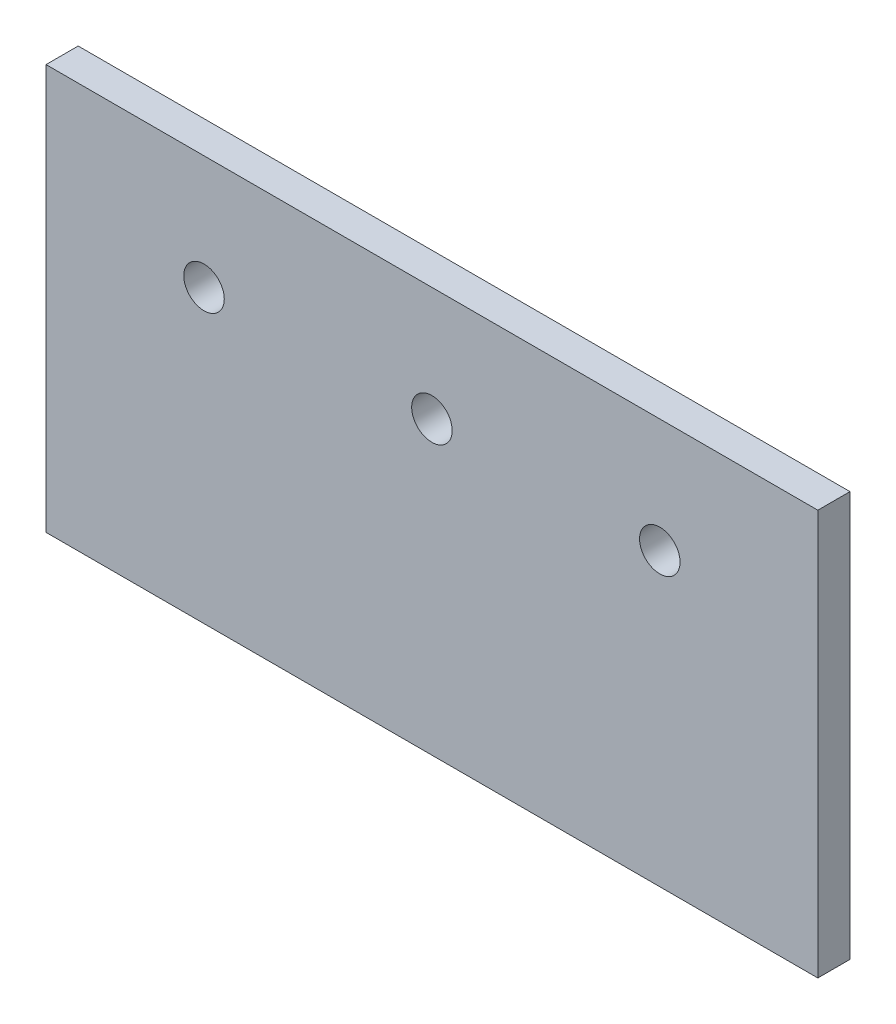
ISO-10303-21;
HEADER;
FILE_DESCRIPTION(('STEP AP214'),'2;1');
FILE_NAME('part.step','',(''),(''),'','','');
FILE_SCHEMA(('AUTOMOTIVE_DESIGN { 1 0 10303 214 1 1 1 1 }'));
ENDSEC;
DATA;
#1=APPLICATION_CONTEXT('core data for automotive mechanical design processes');
#2=APPLICATION_PROTOCOL_DEFINITION('international standard','automotive_design',2000,#1);
#3=PRODUCT_CONTEXT('',#1,'mechanical');
#4=PRODUCT('Part','Part','',(#3));
#5=PRODUCT_RELATED_PRODUCT_CATEGORY('part','',(#4));
#6=PRODUCT_DEFINITION_FORMATION('','',#4);
#7=PRODUCT_DEFINITION_CONTEXT('part definition',#1,'design');
#8=PRODUCT_DEFINITION('design','',#6,#7);
#9=PRODUCT_DEFINITION_SHAPE('','',#8);
#10=(LENGTH_UNIT() NAMED_UNIT(*) SI_UNIT(.MILLI.,.METRE.));
#11=(NAMED_UNIT(*) PLANE_ANGLE_UNIT() SI_UNIT($,.RADIAN.));
#12=(NAMED_UNIT(*) SI_UNIT($,.STERADIAN.) SOLID_ANGLE_UNIT());
#13=UNCERTAINTY_MEASURE_WITH_UNIT(LENGTH_MEASURE(1.E-05),#10,'distance_accuracy_value','');
#14=(GEOMETRIC_REPRESENTATION_CONTEXT(3) GLOBAL_UNCERTAINTY_ASSIGNED_CONTEXT((#13)) GLOBAL_UNIT_ASSIGNED_CONTEXT((#10,
#11,#12)) REPRESENTATION_CONTEXT('',''));
#15=CARTESIAN_POINT('',(0.,0.,0.));
#16=DIRECTION('',(0.,0.,1.));
#17=DIRECTION('',(1.,0.,0.));
#18=AXIS2_PLACEMENT_3D('',#15,#16,#17);
#19=CARTESIAN_POINT('',(0.,0.,6.35));
#20=DIRECTION('',(0.,0.,1.));
#21=DIRECTION('',(1.,0.,0.));
#22=AXIS2_PLACEMENT_3D('',#19,#20,#21);
#23=PLANE('',#22);
#24=CARTESIAN_POINT('',(31.2,-22.5,6.35));
#25=DIRECTION('',(0.,0.,1.));
#26=DIRECTION('',(1.,0.,0.));
#27=AXIS2_PLACEMENT_3D('',#24,#25,#26);
#28=CIRCLE('',#27,4.00000000000001);
#29=CARTESIAN_POINT('',(35.2,-22.5,6.35));
#30=VERTEX_POINT('',#29);
#31=EDGE_CURVE('E134',#30,#30,#28,.T.);
#32=ORIENTED_EDGE('',*,*,#31,.F.);
#33=EDGE_LOOP('',(#32));
#34=FACE_BOUND('',#33,.T.);
#35=DIRECTION('',(0.,-1.,0.));
#36=VECTOR('',#35,1.);
#37=CARTESIAN_POINT('',(0.,0.,6.35));
#38=LINE('',#37,#36);
#39=CARTESIAN_POINT('',(0.,0.,6.35));
#40=VERTEX_POINT('',#39);
#41=CARTESIAN_POINT('',(0.,-80.,6.35));
#42=VERTEX_POINT('',#41);
#43=EDGE_CURVE('E92',#40,#42,#38,.T.);
#44=ORIENTED_EDGE('',*,*,#43,.T.);
#45=DIRECTION('',(1.,0.,0.));
#46=VECTOR('',#45,1.);
#47=CARTESIAN_POINT('',(0.,-80.,6.35));
#48=LINE('',#47,#46);
#49=CARTESIAN_POINT('',(152.4,-80.,6.35));
#50=VERTEX_POINT('',#49);
#51=EDGE_CURVE('E87',#42,#50,#48,.T.);
#52=ORIENTED_EDGE('',*,*,#51,.T.);
#53=DIRECTION('',(0.,1.,0.));
#54=VECTOR('',#53,1.);
#55=CARTESIAN_POINT('',(152.4,0.,6.35));
#56=LINE('',#55,#54);
#57=CARTESIAN_POINT('',(152.4,0.,6.35));
#58=VERTEX_POINT('',#57);
#59=EDGE_CURVE('E90',#50,#58,#56,.T.);
#60=ORIENTED_EDGE('',*,*,#59,.T.);
#61=DIRECTION('',(-1.,0.,0.));
#62=VECTOR('',#61,1.);
#63=CARTESIAN_POINT('',(0.,0.,6.35));
#64=LINE('',#63,#62);
#65=EDGE_CURVE('E57',#58,#40,#64,.T.);
#66=ORIENTED_EDGE('',*,*,#65,.T.);
#67=EDGE_LOOP('',(#44,#52,#60,#66));
#68=FACE_BOUND('',#67,.T.);
#69=CARTESIAN_POINT('',(76.2,-22.5,6.35));
#70=DIRECTION('',(0.,0.,1.));
#71=DIRECTION('',(1.,0.,0.));
#72=AXIS2_PLACEMENT_3D('',#69,#70,#71);
#73=CIRCLE('',#72,3.99999999999999);
#74=CARTESIAN_POINT('',(80.2,-22.5,6.35));
#75=VERTEX_POINT('',#74);
#76=EDGE_CURVE('E112',#75,#75,#73,.T.);
#77=ORIENTED_EDGE('',*,*,#76,.F.);
#78=EDGE_LOOP('',(#77));
#79=FACE_BOUND('',#78,.T.);
#80=CARTESIAN_POINT('',(121.2,-22.5,6.35));
#81=DIRECTION('',(0.,0.,1.));
#82=DIRECTION('',(1.,0.,0.));
#83=AXIS2_PLACEMENT_3D('',#80,#81,#82);
#84=CIRCLE('',#83,3.99999999999999);
#85=CARTESIAN_POINT('',(125.2,-22.5,6.35));
#86=VERTEX_POINT('',#85);
#87=EDGE_CURVE('E142',#86,#86,#84,.T.);
#88=ORIENTED_EDGE('',*,*,#87,.F.);
#89=EDGE_LOOP('',(#88));
#90=FACE_BOUND('',#89,.T.);
#91=ADVANCED_FACE('F39',(#34,#68,#79,#90),#23,.T.);
#92=CARTESIAN_POINT('',(0.,0.,0.));
#93=DIRECTION('',(0.,0.,1.));
#94=DIRECTION('',(1.,0.,0.));
#95=AXIS2_PLACEMENT_3D('',#92,#93,#94);
#96=PLANE('',#95);
#97=DIRECTION('',(0.,-1.,0.));
#98=VECTOR('',#97,1.);
#99=CARTESIAN_POINT('',(0.,0.,0.));
#100=LINE('',#99,#98);
#101=CARTESIAN_POINT('',(0.,0.,0.));
#102=VERTEX_POINT('',#101);
#103=CARTESIAN_POINT('',(0.,-80.,0.));
#104=VERTEX_POINT('',#103);
#105=EDGE_CURVE('E108',#102,#104,#100,.T.);
#106=ORIENTED_EDGE('',*,*,#105,.F.);
#107=DIRECTION('',(-1.,0.,0.));
#108=VECTOR('',#107,1.);
#109=CARTESIAN_POINT('',(0.,0.,0.));
#110=LINE('',#109,#108);
#111=CARTESIAN_POINT('',(152.4,0.,0.));
#112=VERTEX_POINT('',#111);
#113=EDGE_CURVE('E80',#112,#102,#110,.T.);
#114=ORIENTED_EDGE('',*,*,#113,.F.);
#115=DIRECTION('',(0.,1.,0.));
#116=VECTOR('',#115,1.);
#117=CARTESIAN_POINT('',(152.4,0.,0.));
#118=LINE('',#117,#116);
#119=CARTESIAN_POINT('',(152.4,-80.,0.));
#120=VERTEX_POINT('',#119);
#121=EDGE_CURVE('E74',#120,#112,#118,.T.);
#122=ORIENTED_EDGE('',*,*,#121,.F.);
#123=DIRECTION('',(1.,0.,0.));
#124=VECTOR('',#123,1.);
#125=CARTESIAN_POINT('',(0.,-80.,0.));
#126=LINE('',#125,#124);
#127=EDGE_CURVE('E97',#104,#120,#126,.T.);
#128=ORIENTED_EDGE('',*,*,#127,.F.);
#129=EDGE_LOOP('',(#106,#114,#122,#128));
#130=FACE_BOUND('',#129,.T.);
#131=CARTESIAN_POINT('',(76.2,-22.5,0.));
#132=DIRECTION('',(0.,0.,1.));
#133=DIRECTION('',(1.,0.,0.));
#134=AXIS2_PLACEMENT_3D('',#131,#132,#133);
#135=CIRCLE('',#134,3.99999999999999);
#136=CARTESIAN_POINT('',(80.2,-22.5,0.));
#137=VERTEX_POINT('',#136);
#138=EDGE_CURVE('E130',#137,#137,#135,.T.);
#139=ORIENTED_EDGE('',*,*,#138,.T.);
#140=EDGE_LOOP('',(#139));
#141=FACE_BOUND('',#140,.T.);
#142=CARTESIAN_POINT('',(31.2,-22.5,0.));
#143=DIRECTION('',(0.,0.,1.));
#144=DIRECTION('',(1.,0.,0.));
#145=AXIS2_PLACEMENT_3D('',#142,#143,#144);
#146=CIRCLE('',#145,4.00000000000001);
#147=CARTESIAN_POINT('',(35.2,-22.5,0.));
#148=VERTEX_POINT('',#147);
#149=EDGE_CURVE('E138',#148,#148,#146,.T.);
#150=ORIENTED_EDGE('',*,*,#149,.T.);
#151=EDGE_LOOP('',(#150));
#152=FACE_BOUND('',#151,.T.);
#153=CARTESIAN_POINT('',(121.2,-22.5,0.));
#154=DIRECTION('',(0.,0.,1.));
#155=DIRECTION('',(1.,0.,0.));
#156=AXIS2_PLACEMENT_3D('',#153,#154,#155);
#157=CIRCLE('',#156,3.99999999999999);
#158=CARTESIAN_POINT('',(125.2,-22.5,0.));
#159=VERTEX_POINT('',#158);
#160=EDGE_CURVE('E146',#159,#159,#157,.T.);
#161=ORIENTED_EDGE('',*,*,#160,.T.);
#162=EDGE_LOOP('',(#161));
#163=FACE_BOUND('',#162,.T.);
#164=ADVANCED_FACE('F125',(#130,#141,#152,#163),#96,.F.);
#165=CARTESIAN_POINT('',(0.,0.,6.35));
#166=DIRECTION('',(1.,0.,0.));
#167=DIRECTION('',(0.,0.,-1.));
#168=AXIS2_PLACEMENT_3D('',#165,#166,#167);
#169=PLANE('',#168);
#170=ORIENTED_EDGE('',*,*,#105,.T.);
#171=DIRECTION('',(0.,0.,-1.));
#172=VECTOR('',#171,1.);
#173=CARTESIAN_POINT('',(0.,-80.,6.35));
#174=LINE('',#173,#172);
#175=EDGE_CURVE('E11',#42,#104,#174,.T.);
#176=ORIENTED_EDGE('',*,*,#175,.F.);
#177=ORIENTED_EDGE('',*,*,#43,.F.);
#178=DIRECTION('',(0.,0.,-1.));
#179=VECTOR('',#178,1.);
#180=CARTESIAN_POINT('',(0.,0.,6.35));
#181=LINE('',#180,#179);
#182=EDGE_CURVE('E104',#40,#102,#181,.T.);
#183=ORIENTED_EDGE('',*,*,#182,.T.);
#184=EDGE_LOOP('',(#170,#176,#177,#183));
#185=FACE_BOUND('',#184,.T.);
#186=ADVANCED_FACE('F41',(#185),#169,.F.);
#187=CARTESIAN_POINT('',(0.,-80.,6.35));
#188=DIRECTION('',(0.,1.,0.));
#189=DIRECTION('',(0.,0.,1.));
#190=AXIS2_PLACEMENT_3D('',#187,#188,#189);
#191=PLANE('',#190);
#192=ORIENTED_EDGE('',*,*,#127,.T.);
#193=DIRECTION('',(0.,0.,-1.));
#194=VECTOR('',#193,1.);
#195=CARTESIAN_POINT('',(152.4,-80.,6.35));
#196=LINE('',#195,#194);
#197=EDGE_CURVE('E49',#50,#120,#196,.T.);
#198=ORIENTED_EDGE('',*,*,#197,.F.);
#199=ORIENTED_EDGE('',*,*,#51,.F.);
#200=ORIENTED_EDGE('',*,*,#175,.T.);
#201=EDGE_LOOP('',(#192,#198,#199,#200));
#202=FACE_BOUND('',#201,.T.);
#203=ADVANCED_FACE('F96',(#202),#191,.F.);
#204=CARTESIAN_POINT('',(152.4,0.,6.35));
#205=DIRECTION('',(-1.,0.,0.));
#206=DIRECTION('',(0.,0.,1.));
#207=AXIS2_PLACEMENT_3D('',#204,#205,#206);
#208=PLANE('',#207);
#209=ORIENTED_EDGE('',*,*,#121,.T.);
#210=DIRECTION('',(0.,0.,-1.));
#211=VECTOR('',#210,1.);
#212=CARTESIAN_POINT('',(152.4,0.,6.35));
#213=LINE('',#212,#211);
#214=EDGE_CURVE('E99',#58,#112,#213,.T.);
#215=ORIENTED_EDGE('',*,*,#214,.F.);
#216=ORIENTED_EDGE('',*,*,#59,.F.);
#217=ORIENTED_EDGE('',*,*,#197,.T.);
#218=EDGE_LOOP('',(#209,#215,#216,#217));
#219=FACE_BOUND('',#218,.T.);
#220=ADVANCED_FACE('F100',(#219),#208,.F.);
#221=CARTESIAN_POINT('',(0.,0.,6.35));
#222=DIRECTION('',(0.,-1.,0.));
#223=DIRECTION('',(0.,0.,-1.));
#224=AXIS2_PLACEMENT_3D('',#221,#222,#223);
#225=PLANE('',#224);
#226=ORIENTED_EDGE('',*,*,#113,.T.);
#227=ORIENTED_EDGE('',*,*,#182,.F.);
#228=ORIENTED_EDGE('',*,*,#65,.F.);
#229=ORIENTED_EDGE('',*,*,#214,.T.);
#230=EDGE_LOOP('',(#226,#227,#228,#229));
#231=FACE_BOUND('',#230,.T.);
#232=ADVANCED_FACE('F122',(#231),#225,.F.);
#233=CARTESIAN_POINT('',(76.2,-22.5,6.35));
#234=DIRECTION('',(0.,0.,-1.));
#235=DIRECTION('',(-1.,0.,0.));
#236=AXIS2_PLACEMENT_3D('',#233,#234,#235);
#237=CYLINDRICAL_SURFACE('',#236,3.99999999999999);
#238=ORIENTED_EDGE('',*,*,#76,.T.);
#239=EDGE_LOOP('',(#238));
#240=FACE_BOUND('',#239,.T.);
#241=ORIENTED_EDGE('',*,*,#138,.F.);
#242=EDGE_LOOP('',(#241));
#243=FACE_BOUND('',#242,.T.);
#244=ADVANCED_FACE('F166',(#240,#243),#237,.F.);
#245=CARTESIAN_POINT('',(31.2,-22.5,6.35));
#246=DIRECTION('',(0.,0.,-1.));
#247=DIRECTION('',(-1.,0.,0.));
#248=AXIS2_PLACEMENT_3D('',#245,#246,#247);
#249=CYLINDRICAL_SURFACE('',#248,4.00000000000001);
#250=ORIENTED_EDGE('',*,*,#31,.T.);
#251=EDGE_LOOP('',(#250));
#252=FACE_BOUND('',#251,.T.);
#253=ORIENTED_EDGE('',*,*,#149,.F.);
#254=EDGE_LOOP('',(#253));
#255=FACE_BOUND('',#254,.T.);
#256=ADVANCED_FACE('F212',(#252,#255),#249,.F.);
#257=CARTESIAN_POINT('',(121.2,-22.5,6.35));
#258=DIRECTION('',(0.,0.,-1.));
#259=DIRECTION('',(-1.,0.,0.));
#260=AXIS2_PLACEMENT_3D('',#257,#258,#259);
#261=CYLINDRICAL_SURFACE('',#260,3.99999999999999);
#262=ORIENTED_EDGE('',*,*,#87,.T.);
#263=EDGE_LOOP('',(#262));
#264=FACE_BOUND('',#263,.T.);
#265=ORIENTED_EDGE('',*,*,#160,.F.);
#266=EDGE_LOOP('',(#265));
#267=FACE_BOUND('',#266,.T.);
#268=ADVANCED_FACE('F154',(#264,#267),#261,.F.);
#269=CLOSED_SHELL('',(#91,#164,#186,#203,#220,#232,#244,#256,#268));
#270=MANIFOLD_SOLID_BREP('B2',#269);
#271=ADVANCED_BREP_SHAPE_REPRESENTATION('',(#18,#270),#14);
#272=SHAPE_DEFINITION_REPRESENTATION(#9,#271);
ENDSEC;
END-ISO-10303-21;
